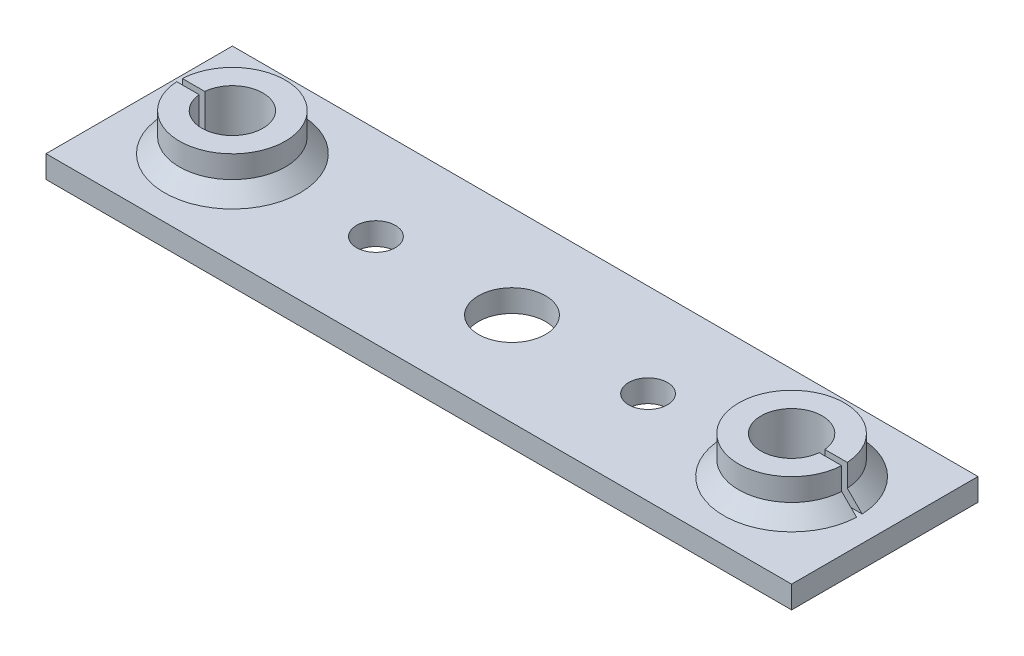
ISO-10303-21;
HEADER;
FILE_DESCRIPTION(('STEP AP214'),'2;1');
FILE_NAME('part.step','',(''),(''),'','','');
FILE_SCHEMA(('AUTOMOTIVE_DESIGN { 1 0 10303 214 1 1 1 1 }'));
ENDSEC;
DATA;
#1=APPLICATION_CONTEXT('core data for automotive mechanical design processes');
#2=APPLICATION_PROTOCOL_DEFINITION('international standard','automotive_design',2000,#1);
#3=PRODUCT_CONTEXT('',#1,'mechanical');
#4=PRODUCT('Part','Part','',(#3));
#5=PRODUCT_RELATED_PRODUCT_CATEGORY('part','',(#4));
#6=PRODUCT_DEFINITION_FORMATION('','',#4);
#7=PRODUCT_DEFINITION_CONTEXT('part definition',#1,'design');
#8=PRODUCT_DEFINITION('design','',#6,#7);
#9=PRODUCT_DEFINITION_SHAPE('','',#8);
#10=(LENGTH_UNIT() NAMED_UNIT(*) SI_UNIT(.MILLI.,.METRE.));
#11=(NAMED_UNIT(*) PLANE_ANGLE_UNIT() SI_UNIT($,.RADIAN.));
#12=(NAMED_UNIT(*) SI_UNIT($,.STERADIAN.) SOLID_ANGLE_UNIT());
#13=UNCERTAINTY_MEASURE_WITH_UNIT(LENGTH_MEASURE(1.E-05),#10,'distance_accuracy_value','');
#14=(GEOMETRIC_REPRESENTATION_CONTEXT(3) GLOBAL_UNCERTAINTY_ASSIGNED_CONTEXT((#13)) GLOBAL_UNIT_ASSIGNED_CONTEXT((#10,
#11,#12)) REPRESENTATION_CONTEXT('',''));
#15=CARTESIAN_POINT('',(0.,0.,0.));
#16=DIRECTION('',(0.,0.,1.));
#17=DIRECTION('',(1.,0.,0.));
#18=AXIS2_PLACEMENT_3D('',#15,#16,#17);
#19=CARTESIAN_POINT('',(0.,3.,0.));
#20=DIRECTION('',(0.,1.,0.));
#21=DIRECTION('',(0.,0.,1.));
#22=AXIS2_PLACEMENT_3D('',#19,#20,#21);
#23=PLANE('',#22);
#24=CARTESIAN_POINT('',(37.5,3.,0.));
#25=DIRECTION('',(0.,1.,0.));
#26=DIRECTION('',(0.,0.,1.));
#27=AXIS2_PLACEMENT_3D('',#24,#25,#26);
#28=CIRCLE('',#27,9.10000000000004);
#29=CARTESIAN_POINT('',(46.5922700685803,3.,0.37499999999999));
#30=VERTEX_POINT('',#29);
#31=CARTESIAN_POINT('',(46.5922700685803,3.,-0.37500000000001));
#32=VERTEX_POINT('',#31);
#33=EDGE_CURVE('E267',#30,#32,#28,.F.);
#34=ORIENTED_EDGE('',*,*,#33,.T.);
#35=DIRECTION('',(1.,0.,0.));
#36=VECTOR('',#35,1.);
#37=CARTESIAN_POINT('',(0.,3.,-0.375000000000005));
#38=LINE('',#37,#36);
#39=CARTESIAN_POINT('',(41.5828145929003,3.,-0.37500000000001));
#40=VERTEX_POINT('',#39);
#41=EDGE_CURVE('E162',#40,#32,#38,.T.);
#42=ORIENTED_EDGE('',*,*,#41,.F.);
#43=CARTESIAN_POINT('',(37.5,3.,0.));
#44=DIRECTION('',(0.,1.,0.));
#45=DIRECTION('',(0.,0.,-1.));
#46=AXIS2_PLACEMENT_3D('',#43,#44,#45);
#47=CIRCLE('',#46,4.1);
#48=CARTESIAN_POINT('',(41.5828145929003,3.,0.374999999999991));
#49=VERTEX_POINT('',#48);
#50=EDGE_CURVE('E223',#49,#40,#47,.T.);
#51=ORIENTED_EDGE('',*,*,#50,.F.);
#52=DIRECTION('',(1.,0.,0.));
#53=VECTOR('',#52,1.);
#54=CARTESIAN_POINT('',(0.,3.,0.374999999999995));
#55=LINE('',#54,#53);
#56=EDGE_CURVE('E173',#49,#30,#55,.T.);
#57=ORIENTED_EDGE('',*,*,#56,.T.);
#58=EDGE_LOOP('',(#34,#42,#51,#57));
#59=FACE_BOUND('',#58,.T.);
#60=DIRECTION('',(-1.,0.,0.));
#61=VECTOR('',#60,1.);
#62=CARTESIAN_POINT('',(0.,3.,-0.375000000000005));
#63=LINE('',#62,#61);
#64=CARTESIAN_POINT('',(-41.5828145929003,3.,-0.375));
#65=VERTEX_POINT('',#64);
#66=CARTESIAN_POINT('',(-46.5922700685802,3.,-0.374999999999999));
#67=VERTEX_POINT('',#66);
#68=EDGE_CURVE('E184',#65,#67,#63,.T.);
#69=ORIENTED_EDGE('',*,*,#68,.T.);
#70=CARTESIAN_POINT('',(-37.5,3.,0.));
#71=DIRECTION('',(0.,1.,0.));
#72=DIRECTION('',(0.,0.,1.));
#73=AXIS2_PLACEMENT_3D('',#70,#71,#72);
#74=CIRCLE('',#73,9.10000000000001);
#75=CARTESIAN_POINT('',(-46.5922700685802,3.,0.375000000000001));
#76=VERTEX_POINT('',#75);
#77=EDGE_CURVE('E264',#67,#76,#74,.F.);
#78=ORIENTED_EDGE('',*,*,#77,.T.);
#79=DIRECTION('',(-1.,0.,0.));
#80=VECTOR('',#79,1.);
#81=CARTESIAN_POINT('',(0.,3.,0.374999999999995));
#82=LINE('',#81,#80);
#83=CARTESIAN_POINT('',(-41.5828145929003,3.,0.375000000000001));
#84=VERTEX_POINT('',#83);
#85=EDGE_CURVE('E152',#84,#76,#82,.T.);
#86=ORIENTED_EDGE('',*,*,#85,.F.);
#87=CARTESIAN_POINT('',(-37.5,3.,0.));
#88=DIRECTION('',(0.,1.,0.));
#89=DIRECTION('',(0.,0.,1.));
#90=AXIS2_PLACEMENT_3D('',#87,#88,#89);
#91=CIRCLE('',#90,4.1);
#92=EDGE_CURVE('E229',#65,#84,#91,.T.);
#93=ORIENTED_EDGE('',*,*,#92,.F.);
#94=EDGE_LOOP('',(#69,#78,#86,#93));
#95=FACE_BOUND('',#94,.T.);
#96=CARTESIAN_POINT('',(18.25,3.,0.));
#97=DIRECTION('',(0.,1.,0.));
#98=DIRECTION('',(0.,0.,-1.));
#99=AXIS2_PLACEMENT_3D('',#96,#97,#98);
#100=CIRCLE('',#99,2.6);
#101=CARTESIAN_POINT('',(18.25,3.,-2.6));
#102=VERTEX_POINT('',#101);
#103=EDGE_CURVE('E211',#102,#102,#100,.T.);
#104=ORIENTED_EDGE('',*,*,#103,.F.);
#105=EDGE_LOOP('',(#104));
#106=FACE_BOUND('',#105,.T.);
#107=DIRECTION('',(0.,0.,1.));
#108=VECTOR('',#107,1.);
#109=CARTESIAN_POINT('',(-50.,3.,12.5));
#110=LINE('',#109,#108);
#111=CARTESIAN_POINT('',(-50.,3.,-12.5));
#112=VERTEX_POINT('',#111);
#113=CARTESIAN_POINT('',(-50.,3.,12.5));
#114=VERTEX_POINT('',#113);
#115=EDGE_CURVE('E235',#112,#114,#110,.T.);
#116=ORIENTED_EDGE('',*,*,#115,.T.);
#117=DIRECTION('',(1.,0.,0.));
#118=VECTOR('',#117,1.);
#119=CARTESIAN_POINT('',(50.,3.,12.5));
#120=LINE('',#119,#118);
#121=CARTESIAN_POINT('',(50.,3.,12.5));
#122=VERTEX_POINT('',#121);
#123=EDGE_CURVE('E238',#114,#122,#120,.T.);
#124=ORIENTED_EDGE('',*,*,#123,.T.);
#125=DIRECTION('',(0.,0.,-1.));
#126=VECTOR('',#125,1.);
#127=CARTESIAN_POINT('',(50.,3.,12.5));
#128=LINE('',#127,#126);
#129=CARTESIAN_POINT('',(50.,3.,-12.5));
#130=VERTEX_POINT('',#129);
#131=EDGE_CURVE('E241',#122,#130,#128,.T.);
#132=ORIENTED_EDGE('',*,*,#131,.T.);
#133=DIRECTION('',(-1.,0.,0.));
#134=VECTOR('',#133,1.);
#135=CARTESIAN_POINT('',(50.,3.,-12.5));
#136=LINE('',#135,#134);
#137=EDGE_CURVE('E243',#130,#112,#136,.T.);
#138=ORIENTED_EDGE('',*,*,#137,.T.);
#139=EDGE_LOOP('',(#116,#124,#132,#138));
#140=FACE_BOUND('',#139,.T.);
#141=CARTESIAN_POINT('',(-18.25,3.,0.));
#142=DIRECTION('',(0.,1.,0.));
#143=DIRECTION('',(0.,0.,1.));
#144=AXIS2_PLACEMENT_3D('',#141,#142,#143);
#145=CIRCLE('',#144,2.6);
#146=CARTESIAN_POINT('',(-18.25,3.,2.6));
#147=VERTEX_POINT('',#146);
#148=EDGE_CURVE('E217',#147,#147,#145,.T.);
#149=ORIENTED_EDGE('',*,*,#148,.F.);
#150=EDGE_LOOP('',(#149));
#151=FACE_BOUND('',#150,.T.);
#152=CARTESIAN_POINT('',(0.,3.,0.));
#153=DIRECTION('',(0.,1.,0.));
#154=DIRECTION('',(0.,0.,1.));
#155=AXIS2_PLACEMENT_3D('',#152,#153,#154);
#156=CIRCLE('',#155,4.5);
#157=CARTESIAN_POINT('',(0.,3.,4.5));
#158=VERTEX_POINT('',#157);
#159=EDGE_CURVE('E205',#158,#158,#156,.T.);
#160=ORIENTED_EDGE('',*,*,#159,.F.);
#161=EDGE_LOOP('',(#160));
#162=FACE_BOUND('',#161,.T.);
#163=ADVANCED_FACE('F35',(#59,#95,#106,#140,#151,#162),#23,.T.);
#164=CARTESIAN_POINT('',(0.,0.,0.));
#165=DIRECTION('',(0.,1.,0.));
#166=DIRECTION('',(0.,0.,1.));
#167=AXIS2_PLACEMENT_3D('',#164,#165,#166);
#168=PLANE('',#167);
#169=DIRECTION('',(0.,0.,1.));
#170=VECTOR('',#169,1.);
#171=CARTESIAN_POINT('',(-50.,0.,12.5));
#172=LINE('',#171,#170);
#173=CARTESIAN_POINT('',(-50.,0.,-12.5));
#174=VERTEX_POINT('',#173);
#175=CARTESIAN_POINT('',(-50.,0.,12.5));
#176=VERTEX_POINT('',#175);
#177=EDGE_CURVE('E232',#174,#176,#172,.T.);
#178=ORIENTED_EDGE('',*,*,#177,.F.);
#179=DIRECTION('',(-1.,0.,0.));
#180=VECTOR('',#179,1.);
#181=CARTESIAN_POINT('',(50.,0.,-12.5));
#182=LINE('',#181,#180);
#183=CARTESIAN_POINT('',(50.,0.,-12.5));
#184=VERTEX_POINT('',#183);
#185=EDGE_CURVE('E239',#184,#174,#182,.T.);
#186=ORIENTED_EDGE('',*,*,#185,.F.);
#187=DIRECTION('',(0.,0.,-1.));
#188=VECTOR('',#187,1.);
#189=CARTESIAN_POINT('',(50.,0.,12.5));
#190=LINE('',#189,#188);
#191=CARTESIAN_POINT('',(50.,0.,12.5));
#192=VERTEX_POINT('',#191);
#193=EDGE_CURVE('E250',#192,#184,#190,.T.);
#194=ORIENTED_EDGE('',*,*,#193,.F.);
#195=DIRECTION('',(1.,0.,0.));
#196=VECTOR('',#195,1.);
#197=CARTESIAN_POINT('',(50.,0.,12.5));
#198=LINE('',#197,#196);
#199=EDGE_CURVE('E248',#176,#192,#198,.T.);
#200=ORIENTED_EDGE('',*,*,#199,.F.);
#201=EDGE_LOOP('',(#178,#186,#194,#200));
#202=FACE_BOUND('',#201,.T.);
#203=CARTESIAN_POINT('',(-37.5,0.,0.));
#204=DIRECTION('',(0.,1.,0.));
#205=DIRECTION('',(0.,0.,1.));
#206=AXIS2_PLACEMENT_3D('',#203,#204,#205);
#207=CIRCLE('',#206,4.1);
#208=CARTESIAN_POINT('',(-37.5,0.,4.1));
#209=VERTEX_POINT('',#208);
#210=EDGE_CURVE('E226',#209,#209,#207,.T.);
#211=ORIENTED_EDGE('',*,*,#210,.T.);
#212=EDGE_LOOP('',(#211));
#213=FACE_BOUND('',#212,.T.);
#214=CARTESIAN_POINT('',(37.5,0.,0.));
#215=DIRECTION('',(0.,1.,0.));
#216=DIRECTION('',(0.,0.,-1.));
#217=AXIS2_PLACEMENT_3D('',#214,#215,#216);
#218=CIRCLE('',#217,4.1);
#219=CARTESIAN_POINT('',(37.5,0.,-4.1));
#220=VERTEX_POINT('',#219);
#221=EDGE_CURVE('E220',#220,#220,#218,.T.);
#222=ORIENTED_EDGE('',*,*,#221,.T.);
#223=EDGE_LOOP('',(#222));
#224=FACE_BOUND('',#223,.T.);
#225=CARTESIAN_POINT('',(-18.25,0.,0.));
#226=DIRECTION('',(0.,1.,0.));
#227=DIRECTION('',(0.,0.,1.));
#228=AXIS2_PLACEMENT_3D('',#225,#226,#227);
#229=CIRCLE('',#228,2.6);
#230=CARTESIAN_POINT('',(-18.25,0.,2.6));
#231=VERTEX_POINT('',#230);
#232=EDGE_CURVE('E214',#231,#231,#229,.T.);
#233=ORIENTED_EDGE('',*,*,#232,.T.);
#234=EDGE_LOOP('',(#233));
#235=FACE_BOUND('',#234,.T.);
#236=CARTESIAN_POINT('',(18.25,0.,0.));
#237=DIRECTION('',(0.,1.,0.));
#238=DIRECTION('',(0.,0.,-1.));
#239=AXIS2_PLACEMENT_3D('',#236,#237,#238);
#240=CIRCLE('',#239,2.6);
#241=CARTESIAN_POINT('',(18.25,0.,-2.6));
#242=VERTEX_POINT('',#241);
#243=EDGE_CURVE('E208',#242,#242,#240,.T.);
#244=ORIENTED_EDGE('',*,*,#243,.T.);
#245=EDGE_LOOP('',(#244));
#246=FACE_BOUND('',#245,.T.);
#247=CARTESIAN_POINT('',(0.,0.,0.));
#248=DIRECTION('',(0.,1.,0.));
#249=DIRECTION('',(0.,0.,1.));
#250=AXIS2_PLACEMENT_3D('',#247,#248,#249);
#251=CIRCLE('',#250,4.5);
#252=CARTESIAN_POINT('',(0.,0.,4.5));
#253=VERTEX_POINT('',#252);
#254=EDGE_CURVE('E204',#253,#253,#251,.T.);
#255=ORIENTED_EDGE('',*,*,#254,.T.);
#256=EDGE_LOOP('',(#255));
#257=FACE_BOUND('',#256,.T.);
#258=ADVANCED_FACE('F297',(#202,#213,#224,#235,#246,#257),#168,.F.);
#259=CARTESIAN_POINT('',(-50.,3.,12.5));
#260=DIRECTION('',(1.,0.,0.));
#261=DIRECTION('',(0.,0.,-1.));
#262=AXIS2_PLACEMENT_3D('',#259,#260,#261);
#263=PLANE('',#262);
#264=ORIENTED_EDGE('',*,*,#177,.T.);
#265=DIRECTION('',(0.,-1.,0.));
#266=VECTOR('',#265,1.);
#267=CARTESIAN_POINT('',(-50.,3.,12.5));
#268=LINE('',#267,#266);
#269=EDGE_CURVE('E261',#114,#176,#268,.T.);
#270=ORIENTED_EDGE('',*,*,#269,.F.);
#271=ORIENTED_EDGE('',*,*,#115,.F.);
#272=DIRECTION('',(0.,-1.,0.));
#273=VECTOR('',#272,1.);
#274=CARTESIAN_POINT('',(-50.,3.,-12.5));
#275=LINE('',#274,#273);
#276=EDGE_CURVE('E245',#112,#174,#275,.T.);
#277=ORIENTED_EDGE('',*,*,#276,.T.);
#278=EDGE_LOOP('',(#264,#270,#271,#277));
#279=FACE_BOUND('',#278,.T.);
#280=ADVANCED_FACE('F292',(#279),#263,.F.);
#281=CARTESIAN_POINT('',(50.,3.,12.5));
#282=DIRECTION('',(0.,0.,-1.));
#283=DIRECTION('',(-1.,0.,0.));
#284=AXIS2_PLACEMENT_3D('',#281,#282,#283);
#285=PLANE('',#284);
#286=ORIENTED_EDGE('',*,*,#199,.T.);
#287=DIRECTION('',(0.,-1.,0.));
#288=VECTOR('',#287,1.);
#289=CARTESIAN_POINT('',(50.,3.,12.5));
#290=LINE('',#289,#288);
#291=EDGE_CURVE('E258',#122,#192,#290,.T.);
#292=ORIENTED_EDGE('',*,*,#291,.F.);
#293=ORIENTED_EDGE('',*,*,#123,.F.);
#294=ORIENTED_EDGE('',*,*,#269,.T.);
#295=EDGE_LOOP('',(#286,#292,#293,#294));
#296=FACE_BOUND('',#295,.T.);
#297=ADVANCED_FACE('F296',(#296),#285,.F.);
#298=CARTESIAN_POINT('',(50.,3.,12.5));
#299=DIRECTION('',(-1.,0.,0.));
#300=DIRECTION('',(0.,0.,1.));
#301=AXIS2_PLACEMENT_3D('',#298,#299,#300);
#302=PLANE('',#301);
#303=ORIENTED_EDGE('',*,*,#193,.T.);
#304=DIRECTION('',(0.,-1.,0.));
#305=VECTOR('',#304,1.);
#306=CARTESIAN_POINT('',(50.,3.,-12.5));
#307=LINE('',#306,#305);
#308=EDGE_CURVE('E255',#130,#184,#307,.T.);
#309=ORIENTED_EDGE('',*,*,#308,.F.);
#310=ORIENTED_EDGE('',*,*,#131,.F.);
#311=ORIENTED_EDGE('',*,*,#291,.T.);
#312=EDGE_LOOP('',(#303,#309,#310,#311));
#313=FACE_BOUND('',#312,.T.);
#314=ADVANCED_FACE('F301',(#313),#302,.F.);
#315=CARTESIAN_POINT('',(50.,3.,-12.5));
#316=DIRECTION('',(0.,0.,1.));
#317=DIRECTION('',(1.,0.,0.));
#318=AXIS2_PLACEMENT_3D('',#315,#316,#317);
#319=PLANE('',#318);
#320=ORIENTED_EDGE('',*,*,#185,.T.);
#321=ORIENTED_EDGE('',*,*,#276,.F.);
#322=ORIENTED_EDGE('',*,*,#137,.F.);
#323=ORIENTED_EDGE('',*,*,#308,.T.);
#324=EDGE_LOOP('',(#320,#321,#322,#323));
#325=FACE_BOUND('',#324,.T.);
#326=ADVANCED_FACE('F305',(#325),#319,.F.);
#327=CARTESIAN_POINT('',(-37.5,3.,0.));
#328=DIRECTION('',(0.,-1.,0.));
#329=DIRECTION('',(0.,0.,-1.));
#330=AXIS2_PLACEMENT_3D('',#327,#328,#329);
#331=CYLINDRICAL_SURFACE('',#330,4.1);
#332=ORIENTED_EDGE('',*,*,#92,.T.);
#333=DIRECTION('',(0.,-1.,0.));
#334=VECTOR('',#333,1.);
#335=CARTESIAN_POINT('',(-41.5828145929003,8.,0.375000000000001));
#336=LINE('',#335,#334);
#337=CARTESIAN_POINT('',(-41.5828145929003,8.,0.375000000000001));
#338=VERTEX_POINT('',#337);
#339=EDGE_CURVE('E191',#338,#84,#336,.T.);
#340=ORIENTED_EDGE('',*,*,#339,.F.);
#341=CARTESIAN_POINT('',(-37.5,8.,0.));
#342=DIRECTION('',(0.,1.,0.));
#343=DIRECTION('',(0.,0.,1.));
#344=AXIS2_PLACEMENT_3D('',#341,#342,#343);
#345=CIRCLE('',#344,4.1);
#346=CARTESIAN_POINT('',(-41.5828145929003,8.,-0.375));
#347=VERTEX_POINT('',#346);
#348=EDGE_CURVE('E189',#347,#338,#345,.F.);
#349=ORIENTED_EDGE('',*,*,#348,.F.);
#350=DIRECTION('',(0.,-1.,0.));
#351=VECTOR('',#350,1.);
#352=CARTESIAN_POINT('',(-41.5828145929003,8.,-0.375));
#353=LINE('',#352,#351);
#354=EDGE_CURVE('E196',#347,#65,#353,.T.);
#355=ORIENTED_EDGE('',*,*,#354,.T.);
#356=EDGE_LOOP('',(#332,#340,#349,#355));
#357=FACE_BOUND('',#356,.T.);
#358=ORIENTED_EDGE('',*,*,#210,.F.);
#359=EDGE_LOOP('',(#358));
#360=FACE_BOUND('',#359,.T.);
#361=ADVANCED_FACE('F309',(#357,#360),#331,.F.);
#362=CARTESIAN_POINT('',(37.5,3.,0.));
#363=DIRECTION('',(0.,-1.,0.));
#364=DIRECTION('',(0.,0.,-1.));
#365=AXIS2_PLACEMENT_3D('',#362,#363,#364);
#366=CYLINDRICAL_SURFACE('',#365,4.1);
#367=ORIENTED_EDGE('',*,*,#50,.T.);
#368=DIRECTION('',(0.,-1.,0.));
#369=VECTOR('',#368,1.);
#370=CARTESIAN_POINT('',(41.5828145929003,8.,-0.37500000000001));
#371=LINE('',#370,#369);
#372=CARTESIAN_POINT('',(41.5828145929003,8.,-0.37500000000001));
#373=VERTEX_POINT('',#372);
#374=EDGE_CURVE('E177',#373,#40,#371,.T.);
#375=ORIENTED_EDGE('',*,*,#374,.F.);
#376=CARTESIAN_POINT('',(37.5,8.,0.));
#377=DIRECTION('',(0.,1.,0.));
#378=DIRECTION('',(0.,0.,1.));
#379=AXIS2_PLACEMENT_3D('',#376,#377,#378);
#380=CIRCLE('',#379,4.1);
#381=CARTESIAN_POINT('',(41.5828145929003,8.,0.37499999999999));
#382=VERTEX_POINT('',#381);
#383=EDGE_CURVE('E167',#382,#373,#380,.F.);
#384=ORIENTED_EDGE('',*,*,#383,.F.);
#385=DIRECTION('',(0.,-1.,0.));
#386=VECTOR('',#385,1.);
#387=CARTESIAN_POINT('',(41.5828145929003,8.,0.37499999999999));
#388=LINE('',#387,#386);
#389=EDGE_CURVE('E153',#382,#49,#388,.T.);
#390=ORIENTED_EDGE('',*,*,#389,.T.);
#391=EDGE_LOOP('',(#367,#375,#384,#390));
#392=FACE_BOUND('',#391,.T.);
#393=ORIENTED_EDGE('',*,*,#221,.F.);
#394=EDGE_LOOP('',(#393));
#395=FACE_BOUND('',#394,.T.);
#396=ADVANCED_FACE('F319',(#392,#395),#366,.F.);
#397=CARTESIAN_POINT('',(-18.25,3.,0.));
#398=DIRECTION('',(0.,-1.,0.));
#399=DIRECTION('',(0.,0.,-1.));
#400=AXIS2_PLACEMENT_3D('',#397,#398,#399);
#401=CYLINDRICAL_SURFACE('',#400,2.6);
#402=ORIENTED_EDGE('',*,*,#148,.T.);
#403=EDGE_LOOP('',(#402));
#404=FACE_BOUND('',#403,.T.);
#405=ORIENTED_EDGE('',*,*,#232,.F.);
#406=EDGE_LOOP('',(#405));
#407=FACE_BOUND('',#406,.T.);
#408=ADVANCED_FACE('F323',(#404,#407),#401,.F.);
#409=CARTESIAN_POINT('',(18.25,3.,0.));
#410=DIRECTION('',(0.,-1.,0.));
#411=DIRECTION('',(0.,0.,-1.));
#412=AXIS2_PLACEMENT_3D('',#409,#410,#411);
#413=CYLINDRICAL_SURFACE('',#412,2.6);
#414=ORIENTED_EDGE('',*,*,#103,.T.);
#415=EDGE_LOOP('',(#414));
#416=FACE_BOUND('',#415,.T.);
#417=ORIENTED_EDGE('',*,*,#243,.F.);
#418=EDGE_LOOP('',(#417));
#419=FACE_BOUND('',#418,.T.);
#420=ADVANCED_FACE('F327',(#416,#419),#413,.F.);
#421=CARTESIAN_POINT('',(0.,3.,0.));
#422=DIRECTION('',(0.,-1.,0.));
#423=DIRECTION('',(0.,0.,-1.));
#424=AXIS2_PLACEMENT_3D('',#421,#422,#423);
#425=CYLINDRICAL_SURFACE('',#424,4.5);
#426=ORIENTED_EDGE('',*,*,#159,.T.);
#427=EDGE_LOOP('',(#426));
#428=FACE_BOUND('',#427,.T.);
#429=ORIENTED_EDGE('',*,*,#254,.F.);
#430=EDGE_LOOP('',(#429));
#431=FACE_BOUND('',#430,.T.);
#432=ADVANCED_FACE('F331',(#428,#431),#425,.F.);
#433=CARTESIAN_POINT('',(0.,8.,0.374999999999995));
#434=DIRECTION('',(0.,0.,1.));
#435=DIRECTION('',(1.,0.,0.));
#436=AXIS2_PLACEMENT_3D('',#433,#434,#435);
#437=PLANE('',#436);
#438=ORIENTED_EDGE('',*,*,#85,.T.);
#439=CARTESIAN_POINT('',(-46.5922700685802,3.,0.375000000000001));
#440=CARTESIAN_POINT('',(-46.2586182600258,3.33337826562822,0.375000000000001));
#441=CARTESIAN_POINT('',(-45.9249440096939,3.66673406501575,0.375000000000001));
#442=CARTESIAN_POINT('',(-45.2575506251017,4.33340073168248,0.375000000000001));
#443=CARTESIAN_POINT('',(-44.9238314908414,4.66671159896163,0.375000000000001));
#444=CARTESIAN_POINT('',(-44.5900899148036,5.00000000000003,0.375000000000001));
#445=B_SPLINE_CURVE_WITH_KNOTS('',3,(#439,#440,#441,#442,#443,#444),.UNSPECIFIED.,.F.,.F.,(4,2,
4),(0.,1.41498457549145,2.82996915256656),.UNSPECIFIED.);
#446=CARTESIAN_POINT('',(-44.5900899148036,5.00000000000003,0.375000000000001));
#447=VERTEX_POINT('',#446);
#448=EDGE_CURVE('E11',#76,#447,#445,.T.);
#449=ORIENTED_EDGE('',*,*,#448,.T.);
#450=DIRECTION('',(0.,-1.,0.));
#451=VECTOR('',#450,1.);
#452=CARTESIAN_POINT('',(-44.5900899148036,8.,0.375000000000001));
#453=LINE('',#452,#451);
#454=CARTESIAN_POINT('',(-44.5900899148036,8.,0.375000000000001));
#455=VERTEX_POINT('',#454);
#456=EDGE_CURVE('E202',#455,#447,#453,.T.);
#457=ORIENTED_EDGE('',*,*,#456,.F.);
#458=DIRECTION('',(-1.,0.,0.));
#459=VECTOR('',#458,1.);
#460=CARTESIAN_POINT('',(0.,8.,0.374999999999995));
#461=LINE('',#460,#459);
#462=EDGE_CURVE('E180',#338,#455,#461,.T.);
#463=ORIENTED_EDGE('',*,*,#462,.F.);
#464=ORIENTED_EDGE('',*,*,#339,.T.);
#465=EDGE_LOOP('',(#438,#449,#457,#463,#464));
#466=FACE_BOUND('',#465,.T.);
#467=ADVANCED_FACE('F334',(#466),#437,.F.);
#468=CARTESIAN_POINT('',(-37.5,8.,0.));
#469=DIRECTION('',(0.,-1.,0.));
#470=DIRECTION('',(0.,0.,-1.));
#471=AXIS2_PLACEMENT_3D('',#468,#469,#470);
#472=CYLINDRICAL_SURFACE('',#471,7.1);
#473=ORIENTED_EDGE('',*,*,#456,.T.);
#474=CARTESIAN_POINT('',(-37.5,5.00000000000003,0.));
#475=DIRECTION('',(0.,1.,0.));
#476=DIRECTION('',(0.,0.,1.));
#477=AXIS2_PLACEMENT_3D('',#474,#475,#476);
#478=CIRCLE('',#477,7.1);
#479=CARTESIAN_POINT('',(-44.5900899148036,5.00000000000003,-0.374999999999999));
#480=VERTEX_POINT('',#479);
#481=EDGE_CURVE('E271',#447,#480,#478,.T.);
#482=ORIENTED_EDGE('',*,*,#481,.T.);
#483=DIRECTION('',(0.,-1.,0.));
#484=VECTOR('',#483,1.);
#485=CARTESIAN_POINT('',(-44.5900899148036,8.,-0.374999999999999));
#486=LINE('',#485,#484);
#487=CARTESIAN_POINT('',(-44.5900899148036,8.,-0.374999999999999));
#488=VERTEX_POINT('',#487);
#489=EDGE_CURVE('E199',#488,#480,#486,.T.);
#490=ORIENTED_EDGE('',*,*,#489,.F.);
#491=CARTESIAN_POINT('',(-37.5,8.,0.));
#492=DIRECTION('',(0.,1.,0.));
#493=DIRECTION('',(0.,0.,1.));
#494=AXIS2_PLACEMENT_3D('',#491,#492,#493);
#495=CIRCLE('',#494,7.1);
#496=EDGE_CURVE('E183',#455,#488,#495,.T.);
#497=ORIENTED_EDGE('',*,*,#496,.F.);
#498=EDGE_LOOP('',(#473,#482,#490,#497));
#499=FACE_BOUND('',#498,.T.);
#500=ADVANCED_FACE('F339',(#499),#472,.T.);
#501=CARTESIAN_POINT('',(0.,8.,-0.375000000000005));
#502=DIRECTION('',(0.,0.,1.));
#503=DIRECTION('',(1.,0.,0.));
#504=AXIS2_PLACEMENT_3D('',#501,#502,#503);
#505=PLANE('',#504);
#506=ORIENTED_EDGE('',*,*,#68,.F.);
#507=ORIENTED_EDGE('',*,*,#354,.F.);
#508=DIRECTION('',(-1.,0.,0.));
#509=VECTOR('',#508,1.);
#510=CARTESIAN_POINT('',(0.,8.,-0.375000000000005));
#511=LINE('',#510,#509);
#512=EDGE_CURVE('E186',#347,#488,#511,.T.);
#513=ORIENTED_EDGE('',*,*,#512,.T.);
#514=ORIENTED_EDGE('',*,*,#489,.T.);
#515=CARTESIAN_POINT('',(-44.5900899148036,5.00000000000003,-0.374999999999999));
#516=CARTESIAN_POINT('',(-44.9238314908414,4.66671159896163,-0.374999999999999));
#517=CARTESIAN_POINT('',(-45.2575506251017,4.33340073168248,-0.374999999999999));
#518=CARTESIAN_POINT('',(-45.9249440096939,3.66673406501575,-0.374999999999999));
#519=CARTESIAN_POINT('',(-46.2586182600258,3.33337826562822,-0.374999999999999));
#520=CARTESIAN_POINT('',(-46.5922700685802,3.,-0.374999999999999));
#521=B_SPLINE_CURVE_WITH_KNOTS('',3,(#515,#516,#517,#518,#519,#520),.UNSPECIFIED.,.F.,.F.,(4,2,
4),(0.,1.41498457707511,2.82996915256655),.UNSPECIFIED.);
#522=EDGE_CURVE('E48',#480,#67,#521,.T.);
#523=ORIENTED_EDGE('',*,*,#522,.T.);
#524=EDGE_LOOP('',(#506,#507,#513,#514,#523));
#525=FACE_BOUND('',#524,.T.);
#526=ADVANCED_FACE('F342',(#525),#505,.T.);
#527=CARTESIAN_POINT('',(0.,8.,0.));
#528=DIRECTION('',(0.,1.,0.));
#529=DIRECTION('',(0.,0.,1.));
#530=AXIS2_PLACEMENT_3D('',#527,#528,#529);
#531=PLANE('',#530);
#532=ORIENTED_EDGE('',*,*,#462,.T.);
#533=ORIENTED_EDGE('',*,*,#496,.T.);
#534=ORIENTED_EDGE('',*,*,#512,.F.);
#535=ORIENTED_EDGE('',*,*,#348,.T.);
#536=EDGE_LOOP('',(#532,#533,#534,#535));
#537=FACE_BOUND('',#536,.T.);
#538=ADVANCED_FACE('F347',(#537),#531,.T.);
#539=CARTESIAN_POINT('',(37.5,8.,0.));
#540=DIRECTION('',(0.,-1.,0.));
#541=DIRECTION('',(0.,0.,-1.));
#542=AXIS2_PLACEMENT_3D('',#539,#540,#541);
#543=CYLINDRICAL_SURFACE('',#542,7.1);
#544=DIRECTION('',(0.,-1.,0.));
#545=VECTOR('',#544,1.);
#546=CARTESIAN_POINT('',(44.5900899148036,8.,-0.37500000000001));
#547=LINE('',#546,#545);
#548=CARTESIAN_POINT('',(44.5900899148036,8.,-0.37500000000001));
#549=VERTEX_POINT('',#548);
#550=CARTESIAN_POINT('',(44.5900899148036,5.00000000000003,-0.37500000000001));
#551=VERTEX_POINT('',#550);
#552=EDGE_CURVE('E172',#549,#551,#547,.T.);
#553=ORIENTED_EDGE('',*,*,#552,.T.);
#554=CARTESIAN_POINT('',(37.5,5.00000000000003,0.));
#555=DIRECTION('',(0.,1.,0.));
#556=DIRECTION('',(0.,0.,1.));
#557=AXIS2_PLACEMENT_3D('',#554,#555,#556);
#558=CIRCLE('',#557,7.1);
#559=CARTESIAN_POINT('',(44.5900899148036,5.00000000000003,0.37499999999999));
#560=VERTEX_POINT('',#559);
#561=EDGE_CURVE('E147',#551,#560,#558,.T.);
#562=ORIENTED_EDGE('',*,*,#561,.T.);
#563=DIRECTION('',(0.,-1.,0.));
#564=VECTOR('',#563,1.);
#565=CARTESIAN_POINT('',(44.5900899148036,8.,0.37499999999999));
#566=LINE('',#565,#564);
#567=CARTESIAN_POINT('',(44.5900899148036,8.,0.37499999999999));
#568=VERTEX_POINT('',#567);
#569=EDGE_CURVE('E141',#568,#560,#566,.T.);
#570=ORIENTED_EDGE('',*,*,#569,.F.);
#571=CARTESIAN_POINT('',(37.5,8.,0.));
#572=DIRECTION('',(0.,1.,0.));
#573=DIRECTION('',(0.,0.,1.));
#574=AXIS2_PLACEMENT_3D('',#571,#572,#573);
#575=CIRCLE('',#574,7.1);
#576=EDGE_CURVE('E145',#568,#549,#575,.F.);
#577=ORIENTED_EDGE('',*,*,#576,.T.);
#578=EDGE_LOOP('',(#553,#562,#570,#577));
#579=FACE_BOUND('',#578,.T.);
#580=ADVANCED_FACE('F144',(#579),#543,.T.);
#581=CARTESIAN_POINT('',(0.,8.,0.374999999999995));
#582=DIRECTION('',(0.,0.,-1.));
#583=DIRECTION('',(-1.,0.,0.));
#584=AXIS2_PLACEMENT_3D('',#581,#582,#583);
#585=PLANE('',#584);
#586=ORIENTED_EDGE('',*,*,#56,.F.);
#587=ORIENTED_EDGE('',*,*,#389,.F.);
#588=DIRECTION('',(1.,0.,0.));
#589=VECTOR('',#588,1.);
#590=CARTESIAN_POINT('',(0.,8.,0.374999999999995));
#591=LINE('',#590,#589);
#592=EDGE_CURVE('E158',#382,#568,#591,.T.);
#593=ORIENTED_EDGE('',*,*,#592,.T.);
#594=ORIENTED_EDGE('',*,*,#569,.T.);
#595=CARTESIAN_POINT('',(44.5900899148036,5.00000000000003,0.37499999999999));
#596=CARTESIAN_POINT('',(44.9238314908414,4.66671159896163,0.37499999999999));
#597=CARTESIAN_POINT('',(45.2575506251017,4.33340073168248,0.37499999999999));
#598=CARTESIAN_POINT('',(45.9249440096939,3.66673406501575,0.37499999999999));
#599=CARTESIAN_POINT('',(46.2586182600258,3.33337826562822,0.37499999999999));
#600=CARTESIAN_POINT('',(46.5922700685803,3.,0.37499999999999));
#601=B_SPLINE_CURVE_WITH_KNOTS('',3,(#595,#596,#597,#598,#599,#600),.UNSPECIFIED.,.F.,.F.,(4,2,
4),(0.,1.41498457707511,2.82996915256657),.UNSPECIFIED.);
#602=EDGE_CURVE('E279',#560,#30,#601,.T.);
#603=ORIENTED_EDGE('',*,*,#602,.T.);
#604=EDGE_LOOP('',(#586,#587,#593,#594,#603));
#605=FACE_BOUND('',#604,.T.);
#606=ADVANCED_FACE('F164',(#605),#585,.T.);
#607=CARTESIAN_POINT('',(0.,8.,-0.375000000000005));
#608=DIRECTION('',(0.,0.,-1.));
#609=DIRECTION('',(-1.,0.,0.));
#610=AXIS2_PLACEMENT_3D('',#607,#608,#609);
#611=PLANE('',#610);
#612=ORIENTED_EDGE('',*,*,#41,.T.);
#613=CARTESIAN_POINT('',(46.5922700685803,3.,-0.37500000000001));
#614=CARTESIAN_POINT('',(46.2586182600258,3.33337826562822,-0.37500000000001));
#615=CARTESIAN_POINT('',(45.9249440096939,3.66673406501575,-0.37500000000001));
#616=CARTESIAN_POINT('',(45.2575506251017,4.33340073168247,-0.37500000000001));
#617=CARTESIAN_POINT('',(44.9238314908414,4.66671159896162,-0.37500000000001));
#618=CARTESIAN_POINT('',(44.5900899148036,5.00000000000002,-0.37500000000001));
#619=B_SPLINE_CURVE_WITH_KNOTS('',3,(#613,#614,#615,#616,#617,#618),.UNSPECIFIED.,.F.,.F.,(4,2,
4),(0.,1.41498457549146,2.82996915256657),.UNSPECIFIED.);
#620=EDGE_CURVE('E273',#32,#551,#619,.T.);
#621=ORIENTED_EDGE('',*,*,#620,.T.);
#622=ORIENTED_EDGE('',*,*,#552,.F.);
#623=DIRECTION('',(1.,0.,0.));
#624=VECTOR('',#623,1.);
#625=CARTESIAN_POINT('',(0.,8.,-0.375000000000005));
#626=LINE('',#625,#624);
#627=EDGE_CURVE('E160',#373,#549,#626,.T.);
#628=ORIENTED_EDGE('',*,*,#627,.F.);
#629=ORIENTED_EDGE('',*,*,#374,.T.);
#630=EDGE_LOOP('',(#612,#621,#622,#628,#629));
#631=FACE_BOUND('',#630,.T.);
#632=ADVANCED_FACE('F284',(#631),#611,.F.);
#633=CARTESIAN_POINT('',(0.,8.,0.));
#634=DIRECTION('',(0.,1.,0.));
#635=DIRECTION('',(0.,0.,1.));
#636=AXIS2_PLACEMENT_3D('',#633,#634,#635);
#637=PLANE('',#636);
#638=ORIENTED_EDGE('',*,*,#576,.F.);
#639=ORIENTED_EDGE('',*,*,#592,.F.);
#640=ORIENTED_EDGE('',*,*,#383,.T.);
#641=ORIENTED_EDGE('',*,*,#627,.T.);
#642=EDGE_LOOP('',(#638,#639,#640,#641));
#643=FACE_BOUND('',#642,.T.);
#644=ADVANCED_FACE('F157',(#643),#637,.T.);
#645=CARTESIAN_POINT('',(37.5,3.,0.));
#646=DIRECTION('',(0.,-1.,0.));
#647=DIRECTION('',(0.,0.,-1.));
#648=AXIS2_PLACEMENT_3D('',#645,#646,#647);
#649=CONICAL_SURFACE('',#648,9.10000000000004,0.785398163397451);
#650=ORIENTED_EDGE('',*,*,#602,.F.);
#651=ORIENTED_EDGE('',*,*,#561,.F.);
#652=ORIENTED_EDGE('',*,*,#620,.F.);
#653=ORIENTED_EDGE('',*,*,#33,.F.);
#654=EDGE_LOOP('',(#650,#651,#652,#653));
#655=FACE_BOUND('',#654,.T.);
#656=ADVANCED_FACE('F287',(#655),#649,.T.);
#657=CARTESIAN_POINT('',(-37.5,5.00000000000003,0.));
#658=DIRECTION('',(0.,-1.,0.));
#659=DIRECTION('',(0.,0.,-1.));
#660=AXIS2_PLACEMENT_3D('',#657,#658,#659);
#661=CONICAL_SURFACE('',#660,7.1,0.785398163397443);
#662=ORIENTED_EDGE('',*,*,#448,.F.);
#663=ORIENTED_EDGE('',*,*,#77,.F.);
#664=ORIENTED_EDGE('',*,*,#522,.F.);
#665=ORIENTED_EDGE('',*,*,#481,.F.);
#666=EDGE_LOOP('',(#662,#663,#664,#665));
#667=FACE_BOUND('',#666,.T.);
#668=ADVANCED_FACE('F37',(#667),#661,.T.);
#669=CLOSED_SHELL('',(#163,#258,#280,#297,#314,#326,#361,#396,#408,#420,#432,#467,#500,#526,
#538,#580,#606,#632,#644,#656,#668));
#670=MANIFOLD_SOLID_BREP('B2',#669);
#671=ADVANCED_BREP_SHAPE_REPRESENTATION('',(#18,#670),#14);
#672=SHAPE_DEFINITION_REPRESENTATION(#9,#671);
ENDSEC;
END-ISO-10303-21;
